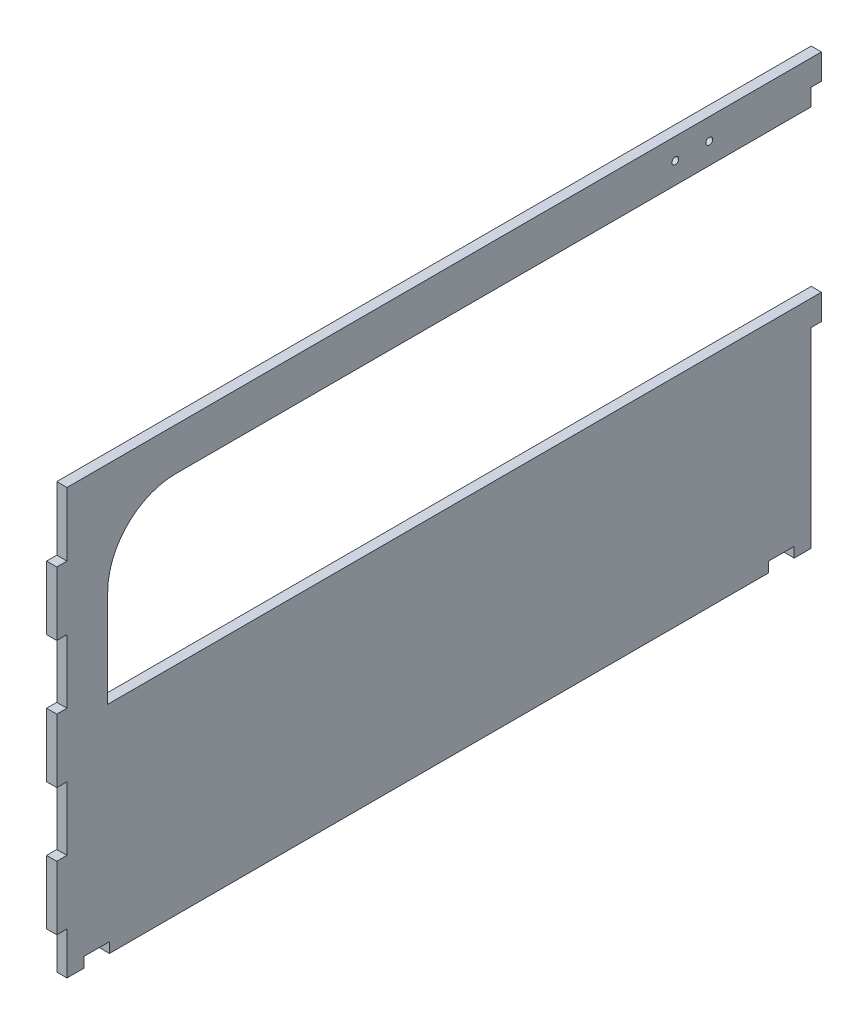
ISO-10303-21;
HEADER;
FILE_DESCRIPTION(('STEP AP214'),'2;1');
FILE_NAME('part.step','',(''),(''),'','','');
FILE_SCHEMA(('AUTOMOTIVE_DESIGN { 1 0 10303 214 1 1 1 1 }'));
ENDSEC;
DATA;
#1=APPLICATION_CONTEXT('core data for automotive mechanical design processes');
#2=APPLICATION_PROTOCOL_DEFINITION('international standard','automotive_design',2000,#1);
#3=PRODUCT_CONTEXT('',#1,'mechanical');
#4=PRODUCT('Part','Part','',(#3));
#5=PRODUCT_RELATED_PRODUCT_CATEGORY('part','',(#4));
#6=PRODUCT_DEFINITION_FORMATION('','',#4);
#7=PRODUCT_DEFINITION_CONTEXT('part definition',#1,'design');
#8=PRODUCT_DEFINITION('design','',#6,#7);
#9=PRODUCT_DEFINITION_SHAPE('','',#8);
#10=(LENGTH_UNIT() NAMED_UNIT(*) SI_UNIT(.MILLI.,.METRE.));
#11=(NAMED_UNIT(*) PLANE_ANGLE_UNIT() SI_UNIT($,.RADIAN.));
#12=(NAMED_UNIT(*) SI_UNIT($,.STERADIAN.) SOLID_ANGLE_UNIT());
#13=UNCERTAINTY_MEASURE_WITH_UNIT(LENGTH_MEASURE(1.E-05),#10,'distance_accuracy_value','');
#14=(GEOMETRIC_REPRESENTATION_CONTEXT(3) GLOBAL_UNCERTAINTY_ASSIGNED_CONTEXT((#13)) GLOBAL_UNIT_ASSIGNED_CONTEXT((#10,
#11,#12)) REPRESENTATION_CONTEXT('',''));
#15=CARTESIAN_POINT('',(0.,0.,0.));
#16=DIRECTION('',(0.,0.,1.));
#17=DIRECTION('',(1.,0.,0.));
#18=AXIS2_PLACEMENT_3D('',#15,#16,#17);
#19=CARTESIAN_POINT('',(6.,0.,0.));
#20=DIRECTION('',(0.,1.,0.));
#21=DIRECTION('',(0.,0.,1.));
#22=AXIS2_PLACEMENT_3D('',#19,#20,#21);
#23=PLANE('',#22);
#24=DIRECTION('',(0.,0.,-1.));
#25=VECTOR('',#24,1.);
#26=CARTESIAN_POINT('',(0.,0.,0.));
#27=LINE('',#26,#25);
#28=CARTESIAN_POINT('',(0.,0.,-6.));
#29=VERTEX_POINT('',#28);
#30=CARTESIAN_POINT('',(0.,0.,-16.));
#31=VERTEX_POINT('',#30);
#32=EDGE_CURVE('E551',#29,#31,#27,.T.);
#33=ORIENTED_EDGE('',*,*,#32,.T.);
#34=DIRECTION('',(-1.,0.,0.));
#35=VECTOR('',#34,1.);
#36=CARTESIAN_POINT('',(6.,0.,-16.));
#37=LINE('',#36,#35);
#38=CARTESIAN_POINT('',(6.,0.,-16.));
#39=VERTEX_POINT('',#38);
#40=EDGE_CURVE('E299',#39,#31,#37,.T.);
#41=ORIENTED_EDGE('',*,*,#40,.F.);
#42=DIRECTION('',(0.,0.,-1.));
#43=VECTOR('',#42,1.);
#44=CARTESIAN_POINT('',(6.,0.,0.));
#45=LINE('',#44,#43);
#46=CARTESIAN_POINT('',(6.,0.,-6.));
#47=VERTEX_POINT('',#46);
#48=EDGE_CURVE('E281',#47,#39,#45,.T.);
#49=ORIENTED_EDGE('',*,*,#48,.F.);
#50=DIRECTION('',(-1.,0.,0.));
#51=VECTOR('',#50,1.);
#52=CARTESIAN_POINT('',(6.,0.,-6.));
#53=LINE('',#52,#51);
#54=EDGE_CURVE('E423',#47,#29,#53,.T.);
#55=ORIENTED_EDGE('',*,*,#54,.T.);
#56=EDGE_LOOP('',(#33,#41,#49,#55));
#57=FACE_BOUND('',#56,.T.);
#58=ADVANCED_FACE('F43',(#57),#23,.F.);
#59=CARTESIAN_POINT('',(6.,0.,-434.));
#60=VERTEX_POINT('',#59);
#61=CARTESIAN_POINT('',(6.,0.,-444.));
#62=VERTEX_POINT('',#61);
#63=EDGE_CURVE('E517',#60,#62,#45,.T.);
#64=ORIENTED_EDGE('',*,*,#63,.F.);
#65=DIRECTION('',(-1.,0.,0.));
#66=VECTOR('',#65,1.);
#67=CARTESIAN_POINT('',(6.,0.,-434.));
#68=LINE('',#67,#66);
#69=CARTESIAN_POINT('',(0.,0.,-434.));
#70=VERTEX_POINT('',#69);
#71=EDGE_CURVE('E309',#60,#70,#68,.T.);
#72=ORIENTED_EDGE('',*,*,#71,.T.);
#73=CARTESIAN_POINT('',(0.,0.,-444.));
#74=VERTEX_POINT('',#73);
#75=EDGE_CURVE('E549',#70,#74,#27,.T.);
#76=ORIENTED_EDGE('',*,*,#75,.T.);
#77=DIRECTION('',(-1.,0.,0.));
#78=VECTOR('',#77,1.);
#79=CARTESIAN_POINT('',(6.,0.,-444.));
#80=LINE('',#79,#78);
#81=EDGE_CURVE('E370',#62,#74,#80,.T.);
#82=ORIENTED_EDGE('',*,*,#81,.F.);
#83=EDGE_LOOP('',(#64,#72,#76,#82));
#84=FACE_BOUND('',#83,.T.);
#85=ADVANCED_FACE('F702',(#84),#23,.F.);
#86=CARTESIAN_POINT('',(6.,0.,0.));
#87=DIRECTION('',(0.,0.,-1.));
#88=DIRECTION('',(-1.,0.,0.));
#89=AXIS2_PLACEMENT_3D('',#86,#87,#88);
#90=PLANE('',#89);
#91=DIRECTION('',(0.,-1.,0.));
#92=VECTOR('',#91,1.);
#93=CARTESIAN_POINT('',(0.,0.,0.));
#94=LINE('',#93,#92);
#95=CARTESIAN_POINT('',(0.,212.5,0.));
#96=VERTEX_POINT('',#95);
#97=CARTESIAN_POINT('',(0.,175.,0.));
#98=VERTEX_POINT('',#97);
#99=EDGE_CURVE('E545',#96,#98,#94,.T.);
#100=ORIENTED_EDGE('',*,*,#99,.T.);
#101=DIRECTION('',(1.,0.,0.));
#102=VECTOR('',#101,1.);
#103=CARTESIAN_POINT('',(0.,175.,0.));
#104=LINE('',#103,#102);
#105=CARTESIAN_POINT('',(6.,175.,0.));
#106=VERTEX_POINT('',#105);
#107=EDGE_CURVE('E419',#98,#106,#104,.T.);
#108=ORIENTED_EDGE('',*,*,#107,.T.);
#109=DIRECTION('',(0.,-1.,0.));
#110=VECTOR('',#109,1.);
#111=CARTESIAN_POINT('',(6.,0.,0.));
#112=LINE('',#111,#110);
#113=CARTESIAN_POINT('',(6.,212.5,0.));
#114=VERTEX_POINT('',#113);
#115=EDGE_CURVE('E513',#114,#106,#112,.T.);
#116=ORIENTED_EDGE('',*,*,#115,.F.);
#117=DIRECTION('',(1.,0.,0.));
#118=VECTOR('',#117,1.);
#119=CARTESIAN_POINT('',(0.,212.5,0.));
#120=LINE('',#119,#118);
#121=EDGE_CURVE('E497',#96,#114,#120,.T.);
#122=ORIENTED_EDGE('',*,*,#121,.F.);
#123=EDGE_LOOP('',(#100,#108,#116,#122));
#124=FACE_BOUND('',#123,.T.);
#125=ADVANCED_FACE('F642',(#124),#90,.F.);
#126=CARTESIAN_POINT('',(6.,137.5,0.));
#127=VERTEX_POINT('',#126);
#128=CARTESIAN_POINT('',(6.,100.,0.));
#129=VERTEX_POINT('',#128);
#130=EDGE_CURVE('E518',#127,#129,#112,.T.);
#131=ORIENTED_EDGE('',*,*,#130,.F.);
#132=DIRECTION('',(1.,0.,0.));
#133=VECTOR('',#132,1.);
#134=CARTESIAN_POINT('',(0.,137.5,0.));
#135=LINE('',#134,#133);
#136=CARTESIAN_POINT('',(0.,137.5,0.));
#137=VERTEX_POINT('',#136);
#138=EDGE_CURVE('E407',#137,#127,#135,.T.);
#139=ORIENTED_EDGE('',*,*,#138,.F.);
#140=CARTESIAN_POINT('',(0.,100.,0.));
#141=VERTEX_POINT('',#140);
#142=EDGE_CURVE('E550',#137,#141,#94,.T.);
#143=ORIENTED_EDGE('',*,*,#142,.T.);
#144=DIRECTION('',(1.,0.,0.));
#145=VECTOR('',#144,1.);
#146=CARTESIAN_POINT('',(0.,100.,0.));
#147=LINE('',#146,#145);
#148=EDGE_CURVE('E413',#141,#129,#147,.T.);
#149=ORIENTED_EDGE('',*,*,#148,.T.);
#150=EDGE_LOOP('',(#131,#139,#143,#149));
#151=FACE_BOUND('',#150,.T.);
#152=ADVANCED_FACE('F659',(#151),#90,.F.);
#153=CARTESIAN_POINT('',(6.,62.5,0.));
#154=VERTEX_POINT('',#153);
#155=CARTESIAN_POINT('',(6.,25.,0.));
#156=VERTEX_POINT('',#155);
#157=EDGE_CURVE('E519',#154,#156,#112,.T.);
#158=ORIENTED_EDGE('',*,*,#157,.F.);
#159=DIRECTION('',(1.,0.,0.));
#160=VECTOR('',#159,1.);
#161=CARTESIAN_POINT('',(0.,62.5,0.));
#162=LINE('',#161,#160);
#163=CARTESIAN_POINT('',(0.,62.5,0.));
#164=VERTEX_POINT('',#163);
#165=EDGE_CURVE('E445',#164,#154,#162,.T.);
#166=ORIENTED_EDGE('',*,*,#165,.F.);
#167=CARTESIAN_POINT('',(0.,25.,0.));
#168=VERTEX_POINT('',#167);
#169=EDGE_CURVE('E507',#164,#168,#94,.T.);
#170=ORIENTED_EDGE('',*,*,#169,.T.);
#171=DIRECTION('',(1.,0.,0.));
#172=VECTOR('',#171,1.);
#173=CARTESIAN_POINT('',(0.,25.,0.));
#174=LINE('',#173,#172);
#175=EDGE_CURVE('E451',#168,#156,#174,.T.);
#176=ORIENTED_EDGE('',*,*,#175,.T.);
#177=EDGE_LOOP('',(#158,#166,#170,#176));
#178=FACE_BOUND('',#177,.T.);
#179=ADVANCED_FACE('F671',(#178),#90,.F.);
#180=CARTESIAN_POINT('',(6.,0.,-31.));
#181=VERTEX_POINT('',#180);
#182=CARTESIAN_POINT('',(6.,0.,-419.));
#183=VERTEX_POINT('',#182);
#184=EDGE_CURVE('E523',#181,#183,#45,.T.);
#185=ORIENTED_EDGE('',*,*,#184,.F.);
#186=DIRECTION('',(-1.,0.,0.));
#187=VECTOR('',#186,1.);
#188=CARTESIAN_POINT('',(6.,0.,-31.));
#189=LINE('',#188,#187);
#190=CARTESIAN_POINT('',(0.,0.,-31.));
#191=VERTEX_POINT('',#190);
#192=EDGE_CURVE('E303',#181,#191,#189,.T.);
#193=ORIENTED_EDGE('',*,*,#192,.T.);
#194=CARTESIAN_POINT('',(0.,0.,-419.));
#195=VERTEX_POINT('',#194);
#196=EDGE_CURVE('E556',#191,#195,#27,.T.);
#197=ORIENTED_EDGE('',*,*,#196,.T.);
#198=DIRECTION('',(-1.,0.,0.));
#199=VECTOR('',#198,1.);
#200=CARTESIAN_POINT('',(6.,0.,-419.));
#201=LINE('',#200,#199);
#202=EDGE_CURVE('E67',#183,#195,#201,.T.);
#203=ORIENTED_EDGE('',*,*,#202,.F.);
#204=EDGE_LOOP('',(#185,#193,#197,#203));
#205=FACE_BOUND('',#204,.T.);
#206=ADVANCED_FACE('F689',(#205),#23,.F.);
#207=CARTESIAN_POINT('',(6.,0.,-450.));
#208=DIRECTION('',(0.,0.,1.));
#209=DIRECTION('',(0.,-1.,0.));
#210=AXIS2_PLACEMENT_3D('',#207,#208,#209);
#211=PLANE('',#210);
#212=DIRECTION('',(0.,1.,0.));
#213=VECTOR('',#212,1.);
#214=CARTESIAN_POINT('',(6.,0.,-450.));
#215=LINE('',#214,#213);
#216=CARTESIAN_POINT('',(6.,112.5,-450.));
#217=VERTEX_POINT('',#216);
#218=CARTESIAN_POINT('',(6.,127.5,-450.));
#219=VERTEX_POINT('',#218);
#220=EDGE_CURVE('E522',#217,#219,#215,.T.);
#221=ORIENTED_EDGE('',*,*,#220,.F.);
#222=DIRECTION('',(-1.,0.,0.));
#223=VECTOR('',#222,1.);
#224=CARTESIAN_POINT('',(6.,112.5,-450.));
#225=LINE('',#224,#223);
#226=CARTESIAN_POINT('',(0.,112.5,-450.));
#227=VERTEX_POINT('',#226);
#228=EDGE_CURVE('E302',#217,#227,#225,.T.);
#229=ORIENTED_EDGE('',*,*,#228,.T.);
#230=DIRECTION('',(0.,1.,0.));
#231=VECTOR('',#230,1.);
#232=CARTESIAN_POINT('',(0.,0.,-450.));
#233=LINE('',#232,#231);
#234=CARTESIAN_POINT('',(0.,127.5,-450.));
#235=VERTEX_POINT('',#234);
#236=EDGE_CURVE('E555',#227,#235,#233,.T.);
#237=ORIENTED_EDGE('',*,*,#236,.T.);
#238=DIRECTION('',(-1.,0.,0.));
#239=VECTOR('',#238,1.);
#240=CARTESIAN_POINT('',(6.,127.5,-450.));
#241=LINE('',#240,#239);
#242=EDGE_CURVE('E584',#219,#235,#241,.T.);
#243=ORIENTED_EDGE('',*,*,#242,.F.);
#244=EDGE_LOOP('',(#221,#229,#237,#243));
#245=FACE_BOUND('',#244,.T.);
#246=ADVANCED_FACE('F733',(#245),#211,.F.);
#247=CARTESIAN_POINT('',(6.,127.5,-450.));
#248=DIRECTION('',(0.,-1.,0.));
#249=DIRECTION('',(0.,0.,-1.));
#250=AXIS2_PLACEMENT_3D('',#247,#248,#249);
#251=PLANE('',#250);
#252=DIRECTION('',(0.,0.,1.));
#253=VECTOR('',#252,1.);
#254=CARTESIAN_POINT('',(0.,127.5,-450.));
#255=LINE('',#254,#253);
#256=CARTESIAN_POINT('',(0.,127.5,-30.));
#257=VERTEX_POINT('',#256);
#258=EDGE_CURVE('E559',#235,#257,#255,.T.);
#259=ORIENTED_EDGE('',*,*,#258,.T.);
#260=DIRECTION('',(-1.,0.,0.));
#261=VECTOR('',#260,1.);
#262=CARTESIAN_POINT('',(6.,127.5,-30.));
#263=LINE('',#262,#261);
#264=CARTESIAN_POINT('',(6.,127.5,-30.));
#265=VERTEX_POINT('',#264);
#266=EDGE_CURVE('E580',#265,#257,#263,.T.);
#267=ORIENTED_EDGE('',*,*,#266,.F.);
#268=DIRECTION('',(0.,0.,1.));
#269=VECTOR('',#268,1.);
#270=CARTESIAN_POINT('',(6.,127.5,-450.));
#271=LINE('',#270,#269);
#272=EDGE_CURVE('E526',#219,#265,#271,.T.);
#273=ORIENTED_EDGE('',*,*,#272,.F.);
#274=ORIENTED_EDGE('',*,*,#242,.T.);
#275=EDGE_LOOP('',(#259,#267,#273,#274));
#276=FACE_BOUND('',#275,.T.);
#277=ADVANCED_FACE('F738',(#276),#251,.F.);
#278=CARTESIAN_POINT('',(6.,225.,-30.));
#279=DIRECTION('',(0.,0.,1.));
#280=DIRECTION('',(1.,0.,0.));
#281=AXIS2_PLACEMENT_3D('',#278,#279,#280);
#282=PLANE('',#281);
#283=DIRECTION('',(0.,1.,0.));
#284=VECTOR('',#283,1.);
#285=CARTESIAN_POINT('',(0.,225.,-30.));
#286=LINE('',#285,#284);
#287=CARTESIAN_POINT('',(0.,185.,-30.));
#288=VERTEX_POINT('',#287);
#289=EDGE_CURVE('E562',#257,#288,#286,.T.);
#290=ORIENTED_EDGE('',*,*,#289,.T.);
#291=DIRECTION('',(-1.,0.,0.));
#292=VECTOR('',#291,1.);
#293=CARTESIAN_POINT('',(6.,185.,-30.));
#294=LINE('',#293,#292);
#295=CARTESIAN_POINT('',(6.,185.,-30.));
#296=VERTEX_POINT('',#295);
#297=EDGE_CURVE('E595',#288,#296,#294,.F.);
#298=ORIENTED_EDGE('',*,*,#297,.T.);
#299=DIRECTION('',(0.,1.,0.));
#300=VECTOR('',#299,1.);
#301=CARTESIAN_POINT('',(6.,225.,-30.));
#302=LINE('',#301,#300);
#303=EDGE_CURVE('E529',#265,#296,#302,.T.);
#304=ORIENTED_EDGE('',*,*,#303,.F.);
#305=ORIENTED_EDGE('',*,*,#266,.T.);
#306=EDGE_LOOP('',(#290,#298,#304,#305));
#307=FACE_BOUND('',#306,.T.);
#308=ADVANCED_FACE('F608',(#307),#282,.F.);
#309=CARTESIAN_POINT('',(6.,225.,-450.));
#310=DIRECTION('',(0.,1.,0.));
#311=DIRECTION('',(0.,0.,1.));
#312=AXIS2_PLACEMENT_3D('',#309,#310,#311);
#313=PLANE('',#312);
#314=DIRECTION('',(0.,0.,-1.));
#315=VECTOR('',#314,1.);
#316=CARTESIAN_POINT('',(0.,225.,-450.));
#317=LINE('',#316,#315);
#318=CARTESIAN_POINT('',(0.,225.,-70.));
#319=VERTEX_POINT('',#318);
#320=CARTESIAN_POINT('',(0.,225.,-444.));
#321=VERTEX_POINT('',#320);
#322=EDGE_CURVE('E566',#319,#321,#317,.T.);
#323=ORIENTED_EDGE('',*,*,#322,.T.);
#324=DIRECTION('',(-1.,0.,0.));
#325=VECTOR('',#324,1.);
#326=CARTESIAN_POINT('',(6.,225.,-444.));
#327=LINE('',#326,#325);
#328=CARTESIAN_POINT('',(6.,225.,-444.));
#329=VERTEX_POINT('',#328);
#330=EDGE_CURVE('E352',#329,#321,#327,.T.);
#331=ORIENTED_EDGE('',*,*,#330,.F.);
#332=DIRECTION('',(0.,0.,-1.));
#333=VECTOR('',#332,1.);
#334=CARTESIAN_POINT('',(6.,225.,-450.));
#335=LINE('',#334,#333);
#336=CARTESIAN_POINT('',(6.,225.,-70.));
#337=VERTEX_POINT('',#336);
#338=EDGE_CURVE('E533',#337,#329,#335,.T.);
#339=ORIENTED_EDGE('',*,*,#338,.F.);
#340=DIRECTION('',(-1.,0.,0.));
#341=VECTOR('',#340,1.);
#342=CARTESIAN_POINT('',(0.,225.,-70.));
#343=LINE('',#342,#341);
#344=EDGE_CURVE('E591',#337,#319,#343,.T.);
#345=ORIENTED_EDGE('',*,*,#344,.T.);
#346=EDGE_LOOP('',(#323,#331,#339,#345));
#347=FACE_BOUND('',#346,.T.);
#348=ADVANCED_FACE('F615',(#347),#313,.F.);
#349=CARTESIAN_POINT('',(6.,225.,-450.));
#350=DIRECTION('',(0.,0.,1.));
#351=DIRECTION('',(1.,0.,0.));
#352=AXIS2_PLACEMENT_3D('',#349,#350,#351);
#353=PLANE('',#352);
#354=DIRECTION('',(0.,1.,0.));
#355=VECTOR('',#354,1.);
#356=CARTESIAN_POINT('',(6.,225.,-450.));
#357=LINE('',#356,#355);
#358=CARTESIAN_POINT('',(6.,235.,-450.));
#359=VERTEX_POINT('',#358);
#360=CARTESIAN_POINT('',(6.,250.,-450.));
#361=VERTEX_POINT('',#360);
#362=EDGE_CURVE('E537',#359,#361,#357,.T.);
#363=ORIENTED_EDGE('',*,*,#362,.F.);
#364=DIRECTION('',(-1.,0.,0.));
#365=VECTOR('',#364,1.);
#366=CARTESIAN_POINT('',(6.,235.,-450.));
#367=LINE('',#366,#365);
#368=CARTESIAN_POINT('',(0.,235.,-450.));
#369=VERTEX_POINT('',#368);
#370=EDGE_CURVE('E360',#359,#369,#367,.T.);
#371=ORIENTED_EDGE('',*,*,#370,.T.);
#372=DIRECTION('',(0.,1.,0.));
#373=VECTOR('',#372,1.);
#374=CARTESIAN_POINT('',(0.,225.,-450.));
#375=LINE('',#374,#373);
#376=CARTESIAN_POINT('',(0.,250.,-450.));
#377=VERTEX_POINT('',#376);
#378=EDGE_CURVE('E570',#369,#377,#375,.T.);
#379=ORIENTED_EDGE('',*,*,#378,.T.);
#380=DIRECTION('',(-1.,0.,0.));
#381=VECTOR('',#380,1.);
#382=CARTESIAN_POINT('',(6.,250.,-450.));
#383=LINE('',#382,#381);
#384=EDGE_CURVE('E544',#361,#377,#383,.T.);
#385=ORIENTED_EDGE('',*,*,#384,.F.);
#386=EDGE_LOOP('',(#363,#371,#379,#385));
#387=FACE_BOUND('',#386,.T.);
#388=ADVANCED_FACE('F626',(#387),#353,.F.);
#389=CARTESIAN_POINT('',(6.,250.,0.));
#390=DIRECTION('',(0.,-1.,0.));
#391=DIRECTION('',(0.,0.,-1.));
#392=AXIS2_PLACEMENT_3D('',#389,#390,#391);
#393=PLANE('',#392);
#394=DIRECTION('',(0.,0.,1.));
#395=VECTOR('',#394,1.);
#396=CARTESIAN_POINT('',(0.,250.,0.));
#397=LINE('',#396,#395);
#398=CARTESIAN_POINT('',(0.,250.,-6.));
#399=VERTEX_POINT('',#398);
#400=EDGE_CURVE('E573',#377,#399,#397,.T.);
#401=ORIENTED_EDGE('',*,*,#400,.T.);
#402=DIRECTION('',(1.,0.,0.));
#403=VECTOR('',#402,1.);
#404=CARTESIAN_POINT('',(0.,250.,-6.));
#405=LINE('',#404,#403);
#406=CARTESIAN_POINT('',(6.,250.,-6.));
#407=VERTEX_POINT('',#406);
#408=EDGE_CURVE('E503',#399,#407,#405,.T.);
#409=ORIENTED_EDGE('',*,*,#408,.T.);
#410=DIRECTION('',(0.,0.,1.));
#411=VECTOR('',#410,1.);
#412=CARTESIAN_POINT('',(6.,250.,0.));
#413=LINE('',#412,#411);
#414=EDGE_CURVE('E540',#361,#407,#413,.T.);
#415=ORIENTED_EDGE('',*,*,#414,.F.);
#416=ORIENTED_EDGE('',*,*,#384,.T.);
#417=EDGE_LOOP('',(#401,#409,#415,#416));
#418=FACE_BOUND('',#417,.T.);
#419=ADVANCED_FACE('F632',(#418),#393,.F.);
#420=CARTESIAN_POINT('',(6.,0.,0.));
#421=DIRECTION('',(-1.,0.,0.));
#422=DIRECTION('',(0.,0.,1.));
#423=AXIS2_PLACEMENT_3D('',#420,#421,#422);
#424=PLANE('',#423);
#425=CARTESIAN_POINT('',(6.,237.5,-384.));
#426=DIRECTION('',(-1.,0.,0.));
#427=DIRECTION('',(0.,0.,1.));
#428=AXIS2_PLACEMENT_3D('',#425,#426,#427);
#429=CIRCLE('',#428,2.);
#430=CARTESIAN_POINT('',(6.,237.5,-382.));
#431=VERTEX_POINT('',#430);
#432=EDGE_CURVE('E322',#431,#431,#429,.T.);
#433=ORIENTED_EDGE('',*,*,#432,.T.);
#434=EDGE_LOOP('',(#433));
#435=FACE_BOUND('',#434,.T.);
#436=CARTESIAN_POINT('',(6.,237.5,-364.));
#437=DIRECTION('',(-1.,0.,0.));
#438=DIRECTION('',(0.,0.,1.));
#439=AXIS2_PLACEMENT_3D('',#436,#437,#438);
#440=CIRCLE('',#439,2.);
#441=CARTESIAN_POINT('',(6.,237.5,-362.));
#442=VERTEX_POINT('',#441);
#443=EDGE_CURVE('E289',#442,#442,#440,.T.);
#444=ORIENTED_EDGE('',*,*,#443,.T.);
#445=EDGE_LOOP('',(#444));
#446=FACE_BOUND('',#445,.T.);
#447=ORIENTED_EDGE('',*,*,#48,.T.);
#448=DIRECTION('',(0.,1.,0.));
#449=VECTOR('',#448,1.);
#450=CARTESIAN_POINT('',(6.,0.,-16.));
#451=LINE('',#450,#449);
#452=CARTESIAN_POINT('',(6.,6.,-16.));
#453=VERTEX_POINT('',#452);
#454=EDGE_CURVE('E260',#39,#453,#451,.T.);
#455=ORIENTED_EDGE('',*,*,#454,.T.);
#456=DIRECTION('',(0.,0.,-1.));
#457=VECTOR('',#456,1.);
#458=CARTESIAN_POINT('',(6.,6.,-16.));
#459=LINE('',#458,#457);
#460=CARTESIAN_POINT('',(6.,6.,-31.));
#461=VERTEX_POINT('',#460);
#462=EDGE_CURVE('E270',#453,#461,#459,.T.);
#463=ORIENTED_EDGE('',*,*,#462,.T.);
#464=DIRECTION('',(0.,-1.,0.));
#465=VECTOR('',#464,1.);
#466=CARTESIAN_POINT('',(6.,0.,-31.));
#467=LINE('',#466,#465);
#468=EDGE_CURVE('E267',#461,#181,#467,.T.);
#469=ORIENTED_EDGE('',*,*,#468,.T.);
#470=ORIENTED_EDGE('',*,*,#184,.T.);
#471=DIRECTION('',(0.,1.,0.));
#472=VECTOR('',#471,1.);
#473=CARTESIAN_POINT('',(6.,0.,-419.));
#474=LINE('',#473,#472);
#475=CARTESIAN_POINT('',(6.,5.99999999999995,-419.));
#476=VERTEX_POINT('',#475);
#477=EDGE_CURVE('E336',#183,#476,#474,.T.);
#478=ORIENTED_EDGE('',*,*,#477,.T.);
#479=DIRECTION('',(0.,0.,-1.));
#480=VECTOR('',#479,1.);
#481=CARTESIAN_POINT('',(6.,5.99999999999995,-434.));
#482=LINE('',#481,#480);
#483=CARTESIAN_POINT('',(6.,5.99999999999995,-434.));
#484=VERTEX_POINT('',#483);
#485=EDGE_CURVE('E313',#476,#484,#482,.T.);
#486=ORIENTED_EDGE('',*,*,#485,.T.);
#487=DIRECTION('',(0.,-1.,0.));
#488=VECTOR('',#487,1.);
#489=CARTESIAN_POINT('',(6.,0.,-434.));
#490=LINE('',#489,#488);
#491=EDGE_CURVE('E328',#484,#60,#490,.T.);
#492=ORIENTED_EDGE('',*,*,#491,.T.);
#493=ORIENTED_EDGE('',*,*,#63,.T.);
#494=DIRECTION('',(0.,1.,0.));
#495=VECTOR('',#494,1.);
#496=CARTESIAN_POINT('',(6.,112.5,-444.));
#497=LINE('',#496,#495);
#498=CARTESIAN_POINT('',(6.,112.5,-444.));
#499=VERTEX_POINT('',#498);
#500=EDGE_CURVE('E384',#62,#499,#497,.T.);
#501=ORIENTED_EDGE('',*,*,#500,.T.);
#502=DIRECTION('',(0.,0.,-1.));
#503=VECTOR('',#502,1.);
#504=CARTESIAN_POINT('',(6.,112.5,-450.));
#505=LINE('',#504,#503);
#506=EDGE_CURVE('E374',#499,#217,#505,.T.);
#507=ORIENTED_EDGE('',*,*,#506,.T.);
#508=ORIENTED_EDGE('',*,*,#220,.T.);
#509=ORIENTED_EDGE('',*,*,#272,.T.);
#510=ORIENTED_EDGE('',*,*,#303,.T.);
#511=CARTESIAN_POINT('',(6.,185.,-70.));
#512=DIRECTION('',(-1.,0.,0.));
#513=DIRECTION('',(0.,0.,1.));
#514=AXIS2_PLACEMENT_3D('',#511,#512,#513);
#515=CIRCLE('',#514,40.);
#516=EDGE_CURVE('E11',#296,#337,#515,.T.);
#517=ORIENTED_EDGE('',*,*,#516,.T.);
#518=ORIENTED_EDGE('',*,*,#338,.T.);
#519=DIRECTION('',(0.,1.,0.));
#520=VECTOR('',#519,1.);
#521=CARTESIAN_POINT('',(6.,235.,-444.));
#522=LINE('',#521,#520);
#523=CARTESIAN_POINT('',(6.,235.,-444.));
#524=VERTEX_POINT('',#523);
#525=EDGE_CURVE('E343',#329,#524,#522,.T.);
#526=ORIENTED_EDGE('',*,*,#525,.T.);
#527=DIRECTION('',(0.,0.,-1.));
#528=VECTOR('',#527,1.);
#529=CARTESIAN_POINT('',(6.,235.,-450.));
#530=LINE('',#529,#528);
#531=EDGE_CURVE('E347',#524,#359,#530,.T.);
#532=ORIENTED_EDGE('',*,*,#531,.T.);
#533=ORIENTED_EDGE('',*,*,#362,.T.);
#534=ORIENTED_EDGE('',*,*,#414,.T.);
#535=DIRECTION('',(0.,1.,0.));
#536=VECTOR('',#535,1.);
#537=CARTESIAN_POINT('',(6.,250.,-6.));
#538=LINE('',#537,#536);
#539=CARTESIAN_POINT('',(6.,212.5,-6.));
#540=VERTEX_POINT('',#539);
#541=EDGE_CURVE('E493',#540,#407,#538,.T.);
#542=ORIENTED_EDGE('',*,*,#541,.F.);
#543=DIRECTION('',(0.,0.,-1.));
#544=VECTOR('',#543,1.);
#545=CARTESIAN_POINT('',(6.,212.5,0.));
#546=LINE('',#545,#544);
#547=EDGE_CURVE('E487',#114,#540,#546,.T.);
#548=ORIENTED_EDGE('',*,*,#547,.F.);
#549=ORIENTED_EDGE('',*,*,#115,.T.);
#550=DIRECTION('',(0.,0.,1.));
#551=VECTOR('',#550,1.);
#552=CARTESIAN_POINT('',(6.,175.,0.));
#553=LINE('',#552,#551);
#554=CARTESIAN_POINT('',(6.,175.,-6.));
#555=VERTEX_POINT('',#554);
#556=EDGE_CURVE('E399',#555,#106,#553,.T.);
#557=ORIENTED_EDGE('',*,*,#556,.F.);
#558=DIRECTION('',(0.,1.,0.));
#559=VECTOR('',#558,1.);
#560=CARTESIAN_POINT('',(6.,175.,-6.));
#561=LINE('',#560,#559);
#562=CARTESIAN_POINT('',(6.,137.5,-6.));
#563=VERTEX_POINT('',#562);
#564=EDGE_CURVE('E412',#563,#555,#561,.T.);
#565=ORIENTED_EDGE('',*,*,#564,.F.);
#566=DIRECTION('',(0.,0.,-1.));
#567=VECTOR('',#566,1.);
#568=CARTESIAN_POINT('',(6.,137.5,0.));
#569=LINE('',#568,#567);
#570=EDGE_CURVE('E408',#127,#563,#569,.T.);
#571=ORIENTED_EDGE('',*,*,#570,.F.);
#572=ORIENTED_EDGE('',*,*,#130,.T.);
#573=DIRECTION('',(0.,0.,1.));
#574=VECTOR('',#573,1.);
#575=CARTESIAN_POINT('',(6.,100.,0.));
#576=LINE('',#575,#574);
#577=CARTESIAN_POINT('',(6.,100.,-6.));
#578=VERTEX_POINT('',#577);
#579=EDGE_CURVE('E437',#578,#129,#576,.T.);
#580=ORIENTED_EDGE('',*,*,#579,.F.);
#581=DIRECTION('',(0.,1.,0.));
#582=VECTOR('',#581,1.);
#583=CARTESIAN_POINT('',(6.,100.,-6.));
#584=LINE('',#583,#582);
#585=CARTESIAN_POINT('',(6.,62.5,-6.));
#586=VERTEX_POINT('',#585);
#587=EDGE_CURVE('E450',#586,#578,#584,.T.);
#588=ORIENTED_EDGE('',*,*,#587,.F.);
#589=DIRECTION('',(0.,0.,-1.));
#590=VECTOR('',#589,1.);
#591=CARTESIAN_POINT('',(6.,62.5,0.));
#592=LINE('',#591,#590);
#593=EDGE_CURVE('E446',#154,#586,#592,.T.);
#594=ORIENTED_EDGE('',*,*,#593,.F.);
#595=ORIENTED_EDGE('',*,*,#157,.T.);
#596=DIRECTION('',(0.,0.,1.));
#597=VECTOR('',#596,1.);
#598=CARTESIAN_POINT('',(6.,25.,0.));
#599=LINE('',#598,#597);
#600=CARTESIAN_POINT('',(6.,25.,-5.99999999999999));
#601=VERTEX_POINT('',#600);
#602=EDGE_CURVE('E473',#601,#156,#599,.T.);
#603=ORIENTED_EDGE('',*,*,#602,.F.);
#604=DIRECTION('',(0.,1.,0.));
#605=VECTOR('',#604,1.);
#606=CARTESIAN_POINT('',(6.,25.,-5.99999999999999));
#607=LINE('',#606,#605);
#608=EDGE_CURVE('E364',#47,#601,#607,.T.);
#609=ORIENTED_EDGE('',*,*,#608,.F.);
#610=EDGE_LOOP('',(#447,#455,#463,#469,#470,#478,#486,#492,#493,#501,#507,#508,#509,#510,#517,
#518,#526,#532,#533,#534,#542,#548,#549,#557,#565,#571,#572,#580,#588,#594,#595,#603,#609));
#611=FACE_BOUND('',#610,.T.);
#612=ADVANCED_FACE('F278',(#435,#446,#611),#424,.F.);
#613=CARTESIAN_POINT('',(0.,0.,0.));
#614=DIRECTION('',(-1.,0.,0.));
#615=DIRECTION('',(0.,0.,1.));
#616=AXIS2_PLACEMENT_3D('',#613,#614,#615);
#617=PLANE('',#616);
#618=CARTESIAN_POINT('',(0.,237.5,-384.));
#619=DIRECTION('',(-1.,0.,0.));
#620=DIRECTION('',(0.,0.,1.));
#621=AXIS2_PLACEMENT_3D('',#618,#619,#620);
#622=CIRCLE('',#621,2.);
#623=CARTESIAN_POINT('',(0.,237.5,-382.));
#624=VERTEX_POINT('',#623);
#625=EDGE_CURVE('E1041',#624,#624,#622,.T.);
#626=ORIENTED_EDGE('',*,*,#625,.F.);
#627=EDGE_LOOP('',(#626));
#628=FACE_BOUND('',#627,.T.);
#629=CARTESIAN_POINT('',(0.,237.5,-364.));
#630=DIRECTION('',(-1.,0.,0.));
#631=DIRECTION('',(0.,0.,1.));
#632=AXIS2_PLACEMENT_3D('',#629,#630,#631);
#633=CIRCLE('',#632,2.);
#634=CARTESIAN_POINT('',(0.,237.5,-362.));
#635=VERTEX_POINT('',#634);
#636=EDGE_CURVE('E1043',#635,#635,#633,.T.);
#637=ORIENTED_EDGE('',*,*,#636,.F.);
#638=EDGE_LOOP('',(#637));
#639=FACE_BOUND('',#638,.T.);
#640=DIRECTION('',(0.,1.,0.));
#641=VECTOR('',#640,1.);
#642=CARTESIAN_POINT('',(0.,0.,-16.));
#643=LINE('',#642,#641);
#644=CARTESIAN_POINT('',(0.,6.,-16.));
#645=VERTEX_POINT('',#644);
#646=EDGE_CURVE('E59',#31,#645,#643,.T.);
#647=ORIENTED_EDGE('',*,*,#646,.F.);
#648=ORIENTED_EDGE('',*,*,#32,.F.);
#649=DIRECTION('',(0.,-1.,0.));
#650=VECTOR('',#649,1.);
#651=CARTESIAN_POINT('',(0.,0.,-6.));
#652=LINE('',#651,#650);
#653=CARTESIAN_POINT('',(0.,25.,-5.99999999999999));
#654=VERTEX_POINT('',#653);
#655=EDGE_CURVE('E588',#654,#29,#652,.T.);
#656=ORIENTED_EDGE('',*,*,#655,.F.);
#657=DIRECTION('',(0.,0.,1.));
#658=VECTOR('',#657,1.);
#659=CARTESIAN_POINT('',(0.,25.,0.));
#660=LINE('',#659,#658);
#661=EDGE_CURVE('E468',#654,#168,#660,.T.);
#662=ORIENTED_EDGE('',*,*,#661,.T.);
#663=ORIENTED_EDGE('',*,*,#169,.F.);
#664=DIRECTION('',(0.,0.,-1.));
#665=VECTOR('',#664,1.);
#666=CARTESIAN_POINT('',(0.,62.5,0.));
#667=LINE('',#666,#665);
#668=CARTESIAN_POINT('',(0.,62.5,-6.));
#669=VERTEX_POINT('',#668);
#670=EDGE_CURVE('E432',#164,#669,#667,.T.);
#671=ORIENTED_EDGE('',*,*,#670,.T.);
#672=DIRECTION('',(0.,1.,0.));
#673=VECTOR('',#672,1.);
#674=CARTESIAN_POINT('',(0.,100.,-6.));
#675=LINE('',#674,#673);
#676=CARTESIAN_POINT('',(0.,100.,-6.));
#677=VERTEX_POINT('',#676);
#678=EDGE_CURVE('E436',#669,#677,#675,.T.);
#679=ORIENTED_EDGE('',*,*,#678,.T.);
#680=DIRECTION('',(0.,0.,1.));
#681=VECTOR('',#680,1.);
#682=CARTESIAN_POINT('',(0.,100.,0.));
#683=LINE('',#682,#681);
#684=EDGE_CURVE('E441',#677,#141,#683,.T.);
#685=ORIENTED_EDGE('',*,*,#684,.T.);
#686=ORIENTED_EDGE('',*,*,#142,.F.);
#687=DIRECTION('',(0.,0.,-1.));
#688=VECTOR('',#687,1.);
#689=CARTESIAN_POINT('',(0.,137.5,0.));
#690=LINE('',#689,#688);
#691=CARTESIAN_POINT('',(0.,137.5,-6.));
#692=VERTEX_POINT('',#691);
#693=EDGE_CURVE('E394',#137,#692,#690,.T.);
#694=ORIENTED_EDGE('',*,*,#693,.T.);
#695=DIRECTION('',(0.,1.,0.));
#696=VECTOR('',#695,1.);
#697=CARTESIAN_POINT('',(0.,175.,-6.));
#698=LINE('',#697,#696);
#699=CARTESIAN_POINT('',(0.,175.,-6.));
#700=VERTEX_POINT('',#699);
#701=EDGE_CURVE('E398',#692,#700,#698,.T.);
#702=ORIENTED_EDGE('',*,*,#701,.T.);
#703=DIRECTION('',(0.,0.,1.));
#704=VECTOR('',#703,1.);
#705=CARTESIAN_POINT('',(0.,175.,0.));
#706=LINE('',#705,#704);
#707=EDGE_CURVE('E403',#700,#98,#706,.T.);
#708=ORIENTED_EDGE('',*,*,#707,.T.);
#709=ORIENTED_EDGE('',*,*,#99,.F.);
#710=DIRECTION('',(0.,0.,-1.));
#711=VECTOR('',#710,1.);
#712=CARTESIAN_POINT('',(0.,212.5,0.));
#713=LINE('',#712,#711);
#714=CARTESIAN_POINT('',(0.,212.5,-6.));
#715=VERTEX_POINT('',#714);
#716=EDGE_CURVE('E488',#96,#715,#713,.T.);
#717=ORIENTED_EDGE('',*,*,#716,.T.);
#718=DIRECTION('',(0.,1.,0.));
#719=VECTOR('',#718,1.);
#720=CARTESIAN_POINT('',(0.,250.,-6.));
#721=LINE('',#720,#719);
#722=EDGE_CURVE('E492',#715,#399,#721,.T.);
#723=ORIENTED_EDGE('',*,*,#722,.T.);
#724=ORIENTED_EDGE('',*,*,#400,.F.);
#725=ORIENTED_EDGE('',*,*,#378,.F.);
#726=DIRECTION('',(0.,0.,-1.));
#727=VECTOR('',#726,1.);
#728=CARTESIAN_POINT('',(0.,235.,-450.));
#729=LINE('',#728,#727);
#730=CARTESIAN_POINT('',(0.,235.,-444.));
#731=VERTEX_POINT('',#730);
#732=EDGE_CURVE('E348',#731,#369,#729,.T.);
#733=ORIENTED_EDGE('',*,*,#732,.F.);
#734=DIRECTION('',(0.,1.,0.));
#735=VECTOR('',#734,1.);
#736=CARTESIAN_POINT('',(0.,235.,-444.));
#737=LINE('',#736,#735);
#738=EDGE_CURVE('E353',#321,#731,#737,.T.);
#739=ORIENTED_EDGE('',*,*,#738,.F.);
#740=ORIENTED_EDGE('',*,*,#322,.F.);
#741=CARTESIAN_POINT('',(0.,185.,-70.));
#742=DIRECTION('',(-1.,0.,0.));
#743=DIRECTION('',(0.,0.,1.));
#744=AXIS2_PLACEMENT_3D('',#741,#742,#743);
#745=CIRCLE('',#744,40.);
#746=EDGE_CURVE('E52',#319,#288,#745,.F.);
#747=ORIENTED_EDGE('',*,*,#746,.T.);
#748=ORIENTED_EDGE('',*,*,#289,.F.);
#749=ORIENTED_EDGE('',*,*,#258,.F.);
#750=ORIENTED_EDGE('',*,*,#236,.F.);
#751=DIRECTION('',(0.,0.,-1.));
#752=VECTOR('',#751,1.);
#753=CARTESIAN_POINT('',(0.,112.5,-450.));
#754=LINE('',#753,#752);
#755=CARTESIAN_POINT('',(0.,112.5,-444.));
#756=VERTEX_POINT('',#755);
#757=EDGE_CURVE('E381',#756,#227,#754,.T.);
#758=ORIENTED_EDGE('',*,*,#757,.F.);
#759=DIRECTION('',(0.,1.,0.));
#760=VECTOR('',#759,1.);
#761=CARTESIAN_POINT('',(0.,112.5,-444.));
#762=LINE('',#761,#760);
#763=EDGE_CURVE('E357',#74,#756,#762,.T.);
#764=ORIENTED_EDGE('',*,*,#763,.F.);
#765=ORIENTED_EDGE('',*,*,#75,.F.);
#766=DIRECTION('',(0.,-1.,0.));
#767=VECTOR('',#766,1.);
#768=CARTESIAN_POINT('',(0.,0.,-434.));
#769=LINE('',#768,#767);
#770=CARTESIAN_POINT('',(0.,5.99999999999995,-434.));
#771=VERTEX_POINT('',#770);
#772=EDGE_CURVE('E296',#771,#70,#769,.T.);
#773=ORIENTED_EDGE('',*,*,#772,.F.);
#774=DIRECTION('',(0.,0.,-1.));
#775=VECTOR('',#774,1.);
#776=CARTESIAN_POINT('',(0.,5.99999999999995,-434.));
#777=LINE('',#776,#775);
#778=CARTESIAN_POINT('',(0.,5.99999999999995,-419.));
#779=VERTEX_POINT('',#778);
#780=EDGE_CURVE('E323',#779,#771,#777,.T.);
#781=ORIENTED_EDGE('',*,*,#780,.F.);
#782=DIRECTION('',(0.,1.,0.));
#783=VECTOR('',#782,1.);
#784=CARTESIAN_POINT('',(0.,0.,-419.));
#785=LINE('',#784,#783);
#786=EDGE_CURVE('E327',#195,#779,#785,.T.);
#787=ORIENTED_EDGE('',*,*,#786,.F.);
#788=ORIENTED_EDGE('',*,*,#196,.F.);
#789=DIRECTION('',(0.,-1.,0.));
#790=VECTOR('',#789,1.);
#791=CARTESIAN_POINT('',(0.,0.,-31.));
#792=LINE('',#791,#790);
#793=CARTESIAN_POINT('',(0.,6.,-31.));
#794=VERTEX_POINT('',#793);
#795=EDGE_CURVE('E283',#794,#191,#792,.T.);
#796=ORIENTED_EDGE('',*,*,#795,.F.);
#797=DIRECTION('',(0.,0.,-1.));
#798=VECTOR('',#797,1.);
#799=CARTESIAN_POINT('',(0.,6.,-16.));
#800=LINE('',#799,#798);
#801=EDGE_CURVE('E286',#645,#794,#800,.T.);
#802=ORIENTED_EDGE('',*,*,#801,.F.);
#803=EDGE_LOOP('',(#647,#648,#656,#662,#663,#671,#679,#685,#686,#694,#702,#708,#709,#717,#723,
#724,#725,#733,#739,#740,#747,#748,#749,#750,#758,#764,#765,#773,#781,#787,#788,#796,#802));
#804=FACE_BOUND('',#803,.T.);
#805=ADVANCED_FACE('F601',(#628,#639,#804),#617,.T.);
#806=CARTESIAN_POINT('',(0.,250.,-6.));
#807=DIRECTION('',(0.,0.,-1.));
#808=DIRECTION('',(0.,1.,0.));
#809=AXIS2_PLACEMENT_3D('',#806,#807,#808);
#810=PLANE('',#809);
#811=ORIENTED_EDGE('',*,*,#541,.T.);
#812=ORIENTED_EDGE('',*,*,#408,.F.);
#813=ORIENTED_EDGE('',*,*,#722,.F.);
#814=DIRECTION('',(1.,0.,0.));
#815=VECTOR('',#814,1.);
#816=CARTESIAN_POINT('',(0.,212.5,-6.));
#817=LINE('',#816,#815);
#818=EDGE_CURVE('E508',#715,#540,#817,.T.);
#819=ORIENTED_EDGE('',*,*,#818,.T.);
#820=EDGE_LOOP('',(#811,#812,#813,#819));
#821=FACE_BOUND('',#820,.T.);
#822=ADVANCED_FACE('F634',(#821),#810,.F.);
#823=CARTESIAN_POINT('',(0.,212.5,0.));
#824=DIRECTION('',(0.,-1.,0.));
#825=DIRECTION('',(0.,0.,-1.));
#826=AXIS2_PLACEMENT_3D('',#823,#824,#825);
#827=PLANE('',#826);
#828=ORIENTED_EDGE('',*,*,#547,.T.);
#829=ORIENTED_EDGE('',*,*,#818,.F.);
#830=ORIENTED_EDGE('',*,*,#716,.F.);
#831=ORIENTED_EDGE('',*,*,#121,.T.);
#832=EDGE_LOOP('',(#828,#829,#830,#831));
#833=FACE_BOUND('',#832,.T.);
#834=ADVANCED_FACE('F639',(#833),#827,.F.);
#835=CARTESIAN_POINT('',(0.,25.,-5.99999999999999));
#836=DIRECTION('',(0.,0.,-1.));
#837=DIRECTION('',(0.,1.,0.));
#838=AXIS2_PLACEMENT_3D('',#835,#836,#837);
#839=PLANE('',#838);
#840=ORIENTED_EDGE('',*,*,#608,.T.);
#841=DIRECTION('',(1.,0.,0.));
#842=VECTOR('',#841,1.);
#843=CARTESIAN_POINT('',(0.,25.,-5.99999999999999));
#844=LINE('',#843,#842);
#845=EDGE_CURVE('E472',#654,#601,#844,.T.);
#846=ORIENTED_EDGE('',*,*,#845,.F.);
#847=ORIENTED_EDGE('',*,*,#655,.T.);
#848=ORIENTED_EDGE('',*,*,#54,.F.);
#849=EDGE_LOOP('',(#840,#846,#847,#848));
#850=FACE_BOUND('',#849,.T.);
#851=ADVANCED_FACE('F680',(#850),#839,.F.);
#852=CARTESIAN_POINT('',(0.,25.,0.));
#853=DIRECTION('',(0.,1.,0.));
#854=DIRECTION('',(0.,0.,1.));
#855=AXIS2_PLACEMENT_3D('',#852,#853,#854);
#856=PLANE('',#855);
#857=ORIENTED_EDGE('',*,*,#602,.T.);
#858=ORIENTED_EDGE('',*,*,#175,.F.);
#859=ORIENTED_EDGE('',*,*,#661,.F.);
#860=ORIENTED_EDGE('',*,*,#845,.T.);
#861=EDGE_LOOP('',(#857,#858,#859,#860));
#862=FACE_BOUND('',#861,.T.);
#863=ADVANCED_FACE('F675',(#862),#856,.F.);
#864=CARTESIAN_POINT('',(0.,100.,0.));
#865=DIRECTION('',(0.,1.,0.));
#866=DIRECTION('',(0.,0.,1.));
#867=AXIS2_PLACEMENT_3D('',#864,#865,#866);
#868=PLANE('',#867);
#869=ORIENTED_EDGE('',*,*,#579,.T.);
#870=ORIENTED_EDGE('',*,*,#148,.F.);
#871=ORIENTED_EDGE('',*,*,#684,.F.);
#872=DIRECTION('',(1.,0.,0.));
#873=VECTOR('',#872,1.);
#874=CARTESIAN_POINT('',(0.,100.,-6.));
#875=LINE('',#874,#873);
#876=EDGE_CURVE('E460',#677,#578,#875,.T.);
#877=ORIENTED_EDGE('',*,*,#876,.T.);
#878=EDGE_LOOP('',(#869,#870,#871,#877));
#879=FACE_BOUND('',#878,.T.);
#880=ADVANCED_FACE('F711',(#879),#868,.F.);
#881=CARTESIAN_POINT('',(0.,100.,-6.));
#882=DIRECTION('',(0.,0.,-1.));
#883=DIRECTION('',(0.,1.,0.));
#884=AXIS2_PLACEMENT_3D('',#881,#882,#883);
#885=PLANE('',#884);
#886=ORIENTED_EDGE('',*,*,#587,.T.);
#887=ORIENTED_EDGE('',*,*,#876,.F.);
#888=ORIENTED_EDGE('',*,*,#678,.F.);
#889=DIRECTION('',(1.,0.,0.));
#890=VECTOR('',#889,1.);
#891=CARTESIAN_POINT('',(0.,62.5,-6.));
#892=LINE('',#891,#890);
#893=EDGE_CURVE('E463',#669,#586,#892,.T.);
#894=ORIENTED_EDGE('',*,*,#893,.T.);
#895=EDGE_LOOP('',(#886,#887,#888,#894));
#896=FACE_BOUND('',#895,.T.);
#897=ADVANCED_FACE('F713',(#896),#885,.F.);
#898=CARTESIAN_POINT('',(0.,62.5,0.));
#899=DIRECTION('',(0.,-1.,0.));
#900=DIRECTION('',(0.,0.,-1.));
#901=AXIS2_PLACEMENT_3D('',#898,#899,#900);
#902=PLANE('',#901);
#903=ORIENTED_EDGE('',*,*,#593,.T.);
#904=ORIENTED_EDGE('',*,*,#893,.F.);
#905=ORIENTED_EDGE('',*,*,#670,.F.);
#906=ORIENTED_EDGE('',*,*,#165,.T.);
#907=EDGE_LOOP('',(#903,#904,#905,#906));
#908=FACE_BOUND('',#907,.T.);
#909=ADVANCED_FACE('F716',(#908),#902,.F.);
#910=CARTESIAN_POINT('',(0.,175.,0.));
#911=DIRECTION('',(0.,1.,0.));
#912=DIRECTION('',(0.,0.,1.));
#913=AXIS2_PLACEMENT_3D('',#910,#911,#912);
#914=PLANE('',#913);
#915=ORIENTED_EDGE('',*,*,#556,.T.);
#916=ORIENTED_EDGE('',*,*,#107,.F.);
#917=ORIENTED_EDGE('',*,*,#707,.F.);
#918=DIRECTION('',(1.,0.,0.));
#919=VECTOR('',#918,1.);
#920=CARTESIAN_POINT('',(0.,175.,-6.));
#921=LINE('',#920,#919);
#922=EDGE_CURVE('E424',#700,#555,#921,.T.);
#923=ORIENTED_EDGE('',*,*,#922,.T.);
#924=EDGE_LOOP('',(#915,#916,#917,#923));
#925=FACE_BOUND('',#924,.T.);
#926=ADVANCED_FACE('F647',(#925),#914,.F.);
#927=CARTESIAN_POINT('',(0.,175.,-6.));
#928=DIRECTION('',(0.,0.,-1.));
#929=DIRECTION('',(0.,1.,0.));
#930=AXIS2_PLACEMENT_3D('',#927,#928,#929);
#931=PLANE('',#930);
#932=ORIENTED_EDGE('',*,*,#564,.T.);
#933=ORIENTED_EDGE('',*,*,#922,.F.);
#934=ORIENTED_EDGE('',*,*,#701,.F.);
#935=DIRECTION('',(1.,0.,0.));
#936=VECTOR('',#935,1.);
#937=CARTESIAN_POINT('',(0.,137.5,-6.));
#938=LINE('',#937,#936);
#939=EDGE_CURVE('E427',#692,#563,#938,.T.);
#940=ORIENTED_EDGE('',*,*,#939,.T.);
#941=EDGE_LOOP('',(#932,#933,#934,#940));
#942=FACE_BOUND('',#941,.T.);
#943=ADVANCED_FACE('F650',(#942),#931,.F.);
#944=CARTESIAN_POINT('',(0.,137.5,0.));
#945=DIRECTION('',(0.,-1.,0.));
#946=DIRECTION('',(0.,0.,-1.));
#947=AXIS2_PLACEMENT_3D('',#944,#945,#946);
#948=PLANE('',#947);
#949=ORIENTED_EDGE('',*,*,#570,.T.);
#950=ORIENTED_EDGE('',*,*,#939,.F.);
#951=ORIENTED_EDGE('',*,*,#693,.F.);
#952=ORIENTED_EDGE('',*,*,#138,.T.);
#953=EDGE_LOOP('',(#949,#950,#951,#952));
#954=FACE_BOUND('',#953,.T.);
#955=ADVANCED_FACE('F653',(#954),#948,.F.);
#956=CARTESIAN_POINT('',(6.,185.,-70.));
#957=DIRECTION('',(1.,0.,0.));
#958=DIRECTION('',(0.,0.,-1.));
#959=AXIS2_PLACEMENT_3D('',#956,#957,#958);
#960=CYLINDRICAL_SURFACE('',#959,40.);
#961=ORIENTED_EDGE('',*,*,#516,.F.);
#962=ORIENTED_EDGE('',*,*,#297,.F.);
#963=ORIENTED_EDGE('',*,*,#746,.F.);
#964=ORIENTED_EDGE('',*,*,#344,.F.);
#965=EDGE_LOOP('',(#961,#962,#963,#964));
#966=FACE_BOUND('',#965,.T.);
#967=ADVANCED_FACE('F45',(#966),#960,.F.);
#968=CARTESIAN_POINT('',(6.,112.5,-450.));
#969=DIRECTION('',(0.,1.,0.));
#970=DIRECTION('',(0.,0.,1.));
#971=AXIS2_PLACEMENT_3D('',#968,#969,#970);
#972=PLANE('',#971);
#973=ORIENTED_EDGE('',*,*,#757,.T.);
#974=ORIENTED_EDGE('',*,*,#228,.F.);
#975=ORIENTED_EDGE('',*,*,#506,.F.);
#976=DIRECTION('',(-1.,0.,0.));
#977=VECTOR('',#976,1.);
#978=CARTESIAN_POINT('',(6.,112.5,-444.));
#979=LINE('',#978,#977);
#980=EDGE_CURVE('E375',#499,#756,#979,.T.);
#981=ORIENTED_EDGE('',*,*,#980,.T.);
#982=EDGE_LOOP('',(#973,#974,#975,#981));
#983=FACE_BOUND('',#982,.T.);
#984=ADVANCED_FACE('F847',(#983),#972,.F.);
#985=CARTESIAN_POINT('',(6.,112.5,-444.));
#986=DIRECTION('',(0.,0.,1.));
#987=DIRECTION('',(1.,0.,0.));
#988=AXIS2_PLACEMENT_3D('',#985,#986,#987);
#989=PLANE('',#988);
#990=ORIENTED_EDGE('',*,*,#763,.T.);
#991=ORIENTED_EDGE('',*,*,#980,.F.);
#992=ORIENTED_EDGE('',*,*,#500,.F.);
#993=ORIENTED_EDGE('',*,*,#81,.T.);
#994=EDGE_LOOP('',(#990,#991,#992,#993));
#995=FACE_BOUND('',#994,.T.);
#996=ADVANCED_FACE('F699',(#995),#989,.F.);
#997=CARTESIAN_POINT('',(6.,235.,-450.));
#998=DIRECTION('',(0.,1.,0.));
#999=DIRECTION('',(0.,0.,1.));
#1000=AXIS2_PLACEMENT_3D('',#997,#998,#999);
#1001=PLANE('',#1000);
#1002=ORIENTED_EDGE('',*,*,#732,.T.);
#1003=ORIENTED_EDGE('',*,*,#370,.F.);
#1004=ORIENTED_EDGE('',*,*,#531,.F.);
#1005=DIRECTION('',(-1.,0.,0.));
#1006=VECTOR('',#1005,1.);
#1007=CARTESIAN_POINT('',(6.,235.,-444.));
#1008=LINE('',#1007,#1006);
#1009=EDGE_CURVE('E365',#524,#731,#1008,.T.);
#1010=ORIENTED_EDGE('',*,*,#1009,.T.);
#1011=EDGE_LOOP('',(#1002,#1003,#1004,#1010));
#1012=FACE_BOUND('',#1011,.T.);
#1013=ADVANCED_FACE('F622',(#1012),#1001,.F.);
#1014=CARTESIAN_POINT('',(6.,235.,-444.));
#1015=DIRECTION('',(0.,0.,1.));
#1016=DIRECTION('',(1.,0.,0.));
#1017=AXIS2_PLACEMENT_3D('',#1014,#1015,#1016);
#1018=PLANE('',#1017);
#1019=ORIENTED_EDGE('',*,*,#738,.T.);
#1020=ORIENTED_EDGE('',*,*,#1009,.F.);
#1021=ORIENTED_EDGE('',*,*,#525,.F.);
#1022=ORIENTED_EDGE('',*,*,#330,.T.);
#1023=EDGE_LOOP('',(#1019,#1020,#1021,#1022));
#1024=FACE_BOUND('',#1023,.T.);
#1025=ADVANCED_FACE('F617',(#1024),#1018,.F.);
#1026=CARTESIAN_POINT('',(6.,0.,-434.));
#1027=DIRECTION('',(0.,0.,-1.));
#1028=DIRECTION('',(-1.,0.,0.));
#1029=AXIS2_PLACEMENT_3D('',#1026,#1027,#1028);
#1030=PLANE('',#1029);
#1031=ORIENTED_EDGE('',*,*,#772,.T.);
#1032=ORIENTED_EDGE('',*,*,#71,.F.);
#1033=ORIENTED_EDGE('',*,*,#491,.F.);
#1034=DIRECTION('',(-1.,0.,0.));
#1035=VECTOR('',#1034,1.);
#1036=CARTESIAN_POINT('',(6.,5.99999999999995,-434.));
#1037=LINE('',#1036,#1035);
#1038=EDGE_CURVE('E319',#484,#771,#1037,.T.);
#1039=ORIENTED_EDGE('',*,*,#1038,.T.);
#1040=EDGE_LOOP('',(#1031,#1032,#1033,#1039));
#1041=FACE_BOUND('',#1040,.T.);
#1042=ADVANCED_FACE('F908',(#1041),#1030,.F.);
#1043=CARTESIAN_POINT('',(6.,5.99999999999995,-434.));
#1044=DIRECTION('',(0.,1.,0.));
#1045=DIRECTION('',(0.,0.,1.));
#1046=AXIS2_PLACEMENT_3D('',#1043,#1044,#1045);
#1047=PLANE('',#1046);
#1048=ORIENTED_EDGE('',*,*,#780,.T.);
#1049=ORIENTED_EDGE('',*,*,#1038,.F.);
#1050=ORIENTED_EDGE('',*,*,#485,.F.);
#1051=DIRECTION('',(-1.,0.,0.));
#1052=VECTOR('',#1051,1.);
#1053=CARTESIAN_POINT('',(6.,5.99999999999995,-419.));
#1054=LINE('',#1053,#1052);
#1055=EDGE_CURVE('E316',#476,#779,#1054,.T.);
#1056=ORIENTED_EDGE('',*,*,#1055,.T.);
#1057=EDGE_LOOP('',(#1048,#1049,#1050,#1056));
#1058=FACE_BOUND('',#1057,.T.);
#1059=ADVANCED_FACE('F932',(#1058),#1047,.F.);
#1060=CARTESIAN_POINT('',(6.,0.,-419.));
#1061=DIRECTION('',(0.,0.,1.));
#1062=DIRECTION('',(1.,0.,0.));
#1063=AXIS2_PLACEMENT_3D('',#1060,#1061,#1062);
#1064=PLANE('',#1063);
#1065=ORIENTED_EDGE('',*,*,#786,.T.);
#1066=ORIENTED_EDGE('',*,*,#1055,.F.);
#1067=ORIENTED_EDGE('',*,*,#477,.F.);
#1068=ORIENTED_EDGE('',*,*,#202,.T.);
#1069=EDGE_LOOP('',(#1065,#1066,#1067,#1068));
#1070=FACE_BOUND('',#1069,.T.);
#1071=ADVANCED_FACE('F942',(#1070),#1064,.F.);
#1072=CARTESIAN_POINT('',(6.,0.,-16.));
#1073=DIRECTION('',(0.,0.,1.));
#1074=DIRECTION('',(1.,0.,0.));
#1075=AXIS2_PLACEMENT_3D('',#1072,#1073,#1074);
#1076=PLANE('',#1075);
#1077=ORIENTED_EDGE('',*,*,#646,.T.);
#1078=DIRECTION('',(-1.,0.,0.));
#1079=VECTOR('',#1078,1.);
#1080=CARTESIAN_POINT('',(6.,6.,-16.));
#1081=LINE('',#1080,#1079);
#1082=EDGE_CURVE('E256',#453,#645,#1081,.T.);
#1083=ORIENTED_EDGE('',*,*,#1082,.F.);
#1084=ORIENTED_EDGE('',*,*,#454,.F.);
#1085=ORIENTED_EDGE('',*,*,#40,.T.);
#1086=EDGE_LOOP('',(#1077,#1083,#1084,#1085));
#1087=FACE_BOUND('',#1086,.T.);
#1088=ADVANCED_FACE('F258',(#1087),#1076,.F.);
#1089=CARTESIAN_POINT('',(6.,0.,-31.));
#1090=DIRECTION('',(0.,0.,-1.));
#1091=DIRECTION('',(-1.,0.,0.));
#1092=AXIS2_PLACEMENT_3D('',#1089,#1090,#1091);
#1093=PLANE('',#1092);
#1094=ORIENTED_EDGE('',*,*,#795,.T.);
#1095=ORIENTED_EDGE('',*,*,#192,.F.);
#1096=ORIENTED_EDGE('',*,*,#468,.F.);
#1097=DIRECTION('',(-1.,0.,0.));
#1098=VECTOR('',#1097,1.);
#1099=CARTESIAN_POINT('',(6.,6.,-31.));
#1100=LINE('',#1099,#1098);
#1101=EDGE_CURVE('E266',#461,#794,#1100,.T.);
#1102=ORIENTED_EDGE('',*,*,#1101,.T.);
#1103=EDGE_LOOP('',(#1094,#1095,#1096,#1102));
#1104=FACE_BOUND('',#1103,.T.);
#1105=ADVANCED_FACE('F686',(#1104),#1093,.F.);
#1106=CARTESIAN_POINT('',(6.,6.,-16.));
#1107=DIRECTION('',(0.,1.,0.));
#1108=DIRECTION('',(0.,0.,1.));
#1109=AXIS2_PLACEMENT_3D('',#1106,#1107,#1108);
#1110=PLANE('',#1109);
#1111=ORIENTED_EDGE('',*,*,#801,.T.);
#1112=ORIENTED_EDGE('',*,*,#1101,.F.);
#1113=ORIENTED_EDGE('',*,*,#462,.F.);
#1114=ORIENTED_EDGE('',*,*,#1082,.T.);
#1115=EDGE_LOOP('',(#1111,#1112,#1113,#1114));
#1116=FACE_BOUND('',#1115,.T.);
#1117=ADVANCED_FACE('F271',(#1116),#1110,.F.);
#1118=CARTESIAN_POINT('',(6.,237.5,-364.));
#1119=DIRECTION('',(-1.,0.,0.));
#1120=DIRECTION('',(0.,0.,1.));
#1121=AXIS2_PLACEMENT_3D('',#1118,#1119,#1120);
#1122=CYLINDRICAL_SURFACE('',#1121,2.);
#1123=ORIENTED_EDGE('',*,*,#443,.F.);
#1124=EDGE_LOOP('',(#1123));
#1125=FACE_BOUND('',#1124,.T.);
#1126=ORIENTED_EDGE('',*,*,#636,.T.);
#1127=EDGE_LOOP('',(#1126));
#1128=FACE_BOUND('',#1127,.T.);
#1129=ADVANCED_FACE('F980',(#1125,#1128),#1122,.F.);
#1130=CARTESIAN_POINT('',(6.,237.5,-384.));
#1131=DIRECTION('',(-1.,0.,0.));
#1132=DIRECTION('',(0.,0.,1.));
#1133=AXIS2_PLACEMENT_3D('',#1130,#1131,#1132);
#1134=CYLINDRICAL_SURFACE('',#1133,2.);
#1135=ORIENTED_EDGE('',*,*,#432,.F.);
#1136=EDGE_LOOP('',(#1135));
#1137=FACE_BOUND('',#1136,.T.);
#1138=ORIENTED_EDGE('',*,*,#625,.T.);
#1139=EDGE_LOOP('',(#1138));
#1140=FACE_BOUND('',#1139,.T.);
#1141=ADVANCED_FACE('F1012',(#1137,#1140),#1134,.F.);
#1142=CLOSED_SHELL('',(#58,#85,#125,#152,#179,#206,#246,#277,#308,#348,#388,#419,#612,#805,#822,
#834,#851,#863,#880,#897,#909,#926,#943,#955,#967,#984,#996,#1013,#1025,#1042,#1059,#1071,#1088,
#1105,#1117,#1129,#1141));
#1143=MANIFOLD_SOLID_BREP('B2',#1142);
#1144=ADVANCED_BREP_SHAPE_REPRESENTATION('',(#18,#1143),#14);
#1145=SHAPE_DEFINITION_REPRESENTATION(#9,#1144);
ENDSEC;
END-ISO-10303-21;
